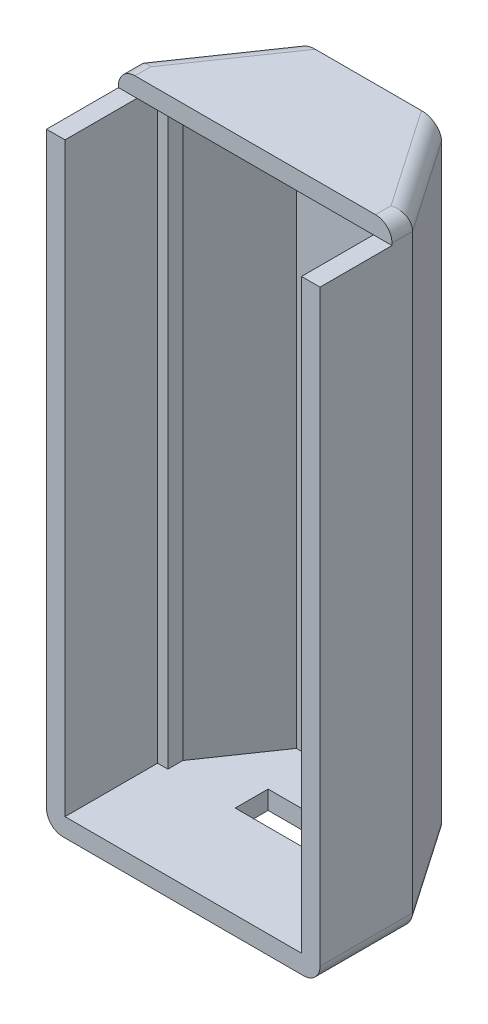
ISO-10303-21;
HEADER;
FILE_DESCRIPTION(('STEP AP214'),'2;1');
FILE_NAME('part.step','',(''),(''),'','','');
FILE_SCHEMA(('AUTOMOTIVE_DESIGN { 1 0 10303 214 1 1 1 1 }'));
ENDSEC;
DATA;
#1=APPLICATION_CONTEXT('core data for automotive mechanical design processes');
#2=APPLICATION_PROTOCOL_DEFINITION('international standard','automotive_design',2000,#1);
#3=PRODUCT_CONTEXT('',#1,'mechanical');
#4=PRODUCT('Part','Part','',(#3));
#5=PRODUCT_RELATED_PRODUCT_CATEGORY('part','',(#4));
#6=PRODUCT_DEFINITION_FORMATION('','',#4);
#7=PRODUCT_DEFINITION_CONTEXT('part definition',#1,'design');
#8=PRODUCT_DEFINITION('design','',#6,#7);
#9=PRODUCT_DEFINITION_SHAPE('','',#8);
#10=(LENGTH_UNIT() NAMED_UNIT(*) SI_UNIT(.MILLI.,.METRE.));
#11=(NAMED_UNIT(*) PLANE_ANGLE_UNIT() SI_UNIT($,.RADIAN.));
#12=(NAMED_UNIT(*) SI_UNIT($,.STERADIAN.) SOLID_ANGLE_UNIT());
#13=UNCERTAINTY_MEASURE_WITH_UNIT(LENGTH_MEASURE(1.E-05),#10,'distance_accuracy_value','');
#14=(GEOMETRIC_REPRESENTATION_CONTEXT(3) GLOBAL_UNCERTAINTY_ASSIGNED_CONTEXT((#13)) GLOBAL_UNIT_ASSIGNED_CONTEXT((#10,
#11,#12)) REPRESENTATION_CONTEXT('',''));
#15=CARTESIAN_POINT('',(0.,0.,0.));
#16=DIRECTION('',(0.,0.,1.));
#17=DIRECTION('',(1.,0.,0.));
#18=AXIS2_PLACEMENT_3D('',#15,#16,#17);
#19=CARTESIAN_POINT('',(0.,57.,0.));
#20=DIRECTION('',(0.,-1.,0.));
#21=DIRECTION('',(0.,0.,-1.));
#22=AXIS2_PLACEMENT_3D('',#19,#20,#21);
#23=PLANE('',#22);
#24=DIRECTION('',(1.,0.,0.));
#25=VECTOR('',#24,1.);
#26=CARTESIAN_POINT('',(13.3,57.,-7.));
#27=LINE('',#26,#25);
#28=CARTESIAN_POINT('',(-13.3,57.,-7.));
#29=VERTEX_POINT('',#28);
#30=CARTESIAN_POINT('',(-11.5,57.,-7.));
#31=VERTEX_POINT('',#30);
#32=EDGE_CURVE('E285',#29,#31,#27,.T.);
#33=ORIENTED_EDGE('',*,*,#32,.F.);
#34=DIRECTION('',(0.,0.,1.));
#35=VECTOR('',#34,1.);
#36=CARTESIAN_POINT('',(-13.3,57.,0.));
#37=LINE('',#36,#35);
#38=CARTESIAN_POINT('',(-13.3,57.,0.));
#39=VERTEX_POINT('',#38);
#40=EDGE_CURVE('E275',#29,#39,#37,.T.);
#41=ORIENTED_EDGE('',*,*,#40,.T.);
#42=DIRECTION('',(1.,0.,0.));
#43=VECTOR('',#42,1.);
#44=CARTESIAN_POINT('',(-11.5,57.,0.));
#45=LINE('',#44,#43);
#46=CARTESIAN_POINT('',(-11.5,57.,0.));
#47=VERTEX_POINT('',#46);
#48=EDGE_CURVE('E405',#39,#47,#45,.T.);
#49=ORIENTED_EDGE('',*,*,#48,.T.);
#50=DIRECTION('',(0.,0.,-1.));
#51=VECTOR('',#50,1.);
#52=CARTESIAN_POINT('',(-11.5,57.,0.));
#53=LINE('',#52,#51);
#54=EDGE_CURVE('E458',#47,#31,#53,.T.);
#55=ORIENTED_EDGE('',*,*,#54,.T.);
#56=EDGE_LOOP('',(#33,#41,#49,#55));
#57=FACE_BOUND('',#56,.T.);
#58=ADVANCED_FACE('F35',(#57),#23,.F.);
#59=CARTESIAN_POINT('',(11.5,57.,-7.));
#60=VERTEX_POINT('',#59);
#61=CARTESIAN_POINT('',(13.3,57.,-7.));
#62=VERTEX_POINT('',#61);
#63=EDGE_CURVE('E270',#60,#62,#27,.T.);
#64=ORIENTED_EDGE('',*,*,#63,.F.);
#65=DIRECTION('',(0.,0.,1.));
#66=VECTOR('',#65,1.);
#67=CARTESIAN_POINT('',(11.5,57.,0.));
#68=LINE('',#67,#66);
#69=CARTESIAN_POINT('',(11.5,57.,0.));
#70=VERTEX_POINT('',#69);
#71=EDGE_CURVE('E436',#60,#70,#68,.T.);
#72=ORIENTED_EDGE('',*,*,#71,.T.);
#73=DIRECTION('',(1.,0.,0.));
#74=VECTOR('',#73,1.);
#75=CARTESIAN_POINT('',(13.3,57.,0.));
#76=LINE('',#75,#74);
#77=CARTESIAN_POINT('',(13.3,57.,0.));
#78=VERTEX_POINT('',#77);
#79=EDGE_CURVE('E273',#70,#78,#76,.T.);
#80=ORIENTED_EDGE('',*,*,#79,.T.);
#81=DIRECTION('',(0.,0.,-1.));
#82=VECTOR('',#81,1.);
#83=CARTESIAN_POINT('',(13.3,57.,-9.));
#84=LINE('',#83,#82);
#85=EDGE_CURVE('E259',#78,#62,#84,.T.);
#86=ORIENTED_EDGE('',*,*,#85,.T.);
#87=EDGE_LOOP('',(#64,#72,#80,#86));
#88=FACE_BOUND('',#87,.T.);
#89=ADVANCED_FACE('F269',(#88),#23,.F.);
#90=CARTESIAN_POINT('',(-11.5,57.,0.));
#91=DIRECTION('',(-1.,0.,0.));
#92=DIRECTION('',(0.,0.,1.));
#93=AXIS2_PLACEMENT_3D('',#90,#91,#92);
#94=PLANE('',#93);
#95=DIRECTION('',(0.,0.,-1.));
#96=VECTOR('',#95,1.);
#97=CARTESIAN_POINT('',(-11.5,0.,0.));
#98=LINE('',#97,#96);
#99=CARTESIAN_POINT('',(-11.5,0.,0.));
#100=VERTEX_POINT('',#99);
#101=CARTESIAN_POINT('',(-11.5,0.,-9.));
#102=VERTEX_POINT('',#101);
#103=EDGE_CURVE('E427',#100,#102,#98,.T.);
#104=ORIENTED_EDGE('',*,*,#103,.T.);
#105=DIRECTION('',(0.,-1.,0.));
#106=VECTOR('',#105,1.);
#107=CARTESIAN_POINT('',(-11.5,57.,-9.));
#108=LINE('',#107,#106);
#109=CARTESIAN_POINT('',(-11.5,57.,-9.));
#110=VERTEX_POINT('',#109);
#111=EDGE_CURVE('E358',#110,#102,#108,.T.);
#112=ORIENTED_EDGE('',*,*,#111,.F.);
#113=EDGE_CURVE('E461',#31,#110,#53,.T.);
#114=ORIENTED_EDGE('',*,*,#113,.F.);
#115=ORIENTED_EDGE('',*,*,#54,.F.);
#116=DIRECTION('',(0.,-1.,0.));
#117=VECTOR('',#116,1.);
#118=CARTESIAN_POINT('',(-11.5,57.,0.));
#119=LINE('',#118,#117);
#120=EDGE_CURVE('E355',#47,#100,#119,.T.);
#121=ORIENTED_EDGE('',*,*,#120,.T.);
#122=EDGE_LOOP('',(#104,#112,#114,#115,#121));
#123=FACE_BOUND('',#122,.T.);
#124=ADVANCED_FACE('F540',(#123),#94,.F.);
#125=CARTESIAN_POINT('',(-11.5,57.,-9.));
#126=DIRECTION('',(0.,0.,-1.));
#127=DIRECTION('',(-1.,0.,0.));
#128=AXIS2_PLACEMENT_3D('',#125,#126,#127);
#129=PLANE('',#128);
#130=DIRECTION('',(1.,0.,0.));
#131=VECTOR('',#130,1.);
#132=CARTESIAN_POINT('',(-11.5,0.,-9.));
#133=LINE('',#132,#131);
#134=CARTESIAN_POINT('',(-10.5,0.,-9.));
#135=VERTEX_POINT('',#134);
#136=EDGE_CURVE('E424',#102,#135,#133,.T.);
#137=ORIENTED_EDGE('',*,*,#136,.T.);
#138=DIRECTION('',(0.,-1.,0.));
#139=VECTOR('',#138,1.);
#140=CARTESIAN_POINT('',(-10.5,57.,-9.));
#141=LINE('',#140,#139);
#142=CARTESIAN_POINT('',(-10.5,57.,-9.));
#143=VERTEX_POINT('',#142);
#144=EDGE_CURVE('E361',#143,#135,#141,.T.);
#145=ORIENTED_EDGE('',*,*,#144,.F.);
#146=DIRECTION('',(1.,0.,0.));
#147=VECTOR('',#146,1.);
#148=CARTESIAN_POINT('',(-11.5,57.,-9.));
#149=LINE('',#148,#147);
#150=EDGE_CURVE('E455',#110,#143,#149,.T.);
#151=ORIENTED_EDGE('',*,*,#150,.F.);
#152=ORIENTED_EDGE('',*,*,#111,.T.);
#153=EDGE_LOOP('',(#137,#145,#151,#152));
#154=FACE_BOUND('',#153,.T.);
#155=ADVANCED_FACE('F648',(#154),#129,.F.);
#156=CARTESIAN_POINT('',(-10.5,57.,-9.));
#157=DIRECTION('',(-1.,0.,0.));
#158=DIRECTION('',(0.,0.,1.));
#159=AXIS2_PLACEMENT_3D('',#156,#157,#158);
#160=PLANE('',#159);
#161=DIRECTION('',(0.,0.,-1.));
#162=VECTOR('',#161,1.);
#163=CARTESIAN_POINT('',(-10.5,0.,-9.));
#164=LINE('',#163,#162);
#165=CARTESIAN_POINT('',(-10.5,0.,-10.4545454545455));
#166=VERTEX_POINT('',#165);
#167=EDGE_CURVE('E421',#135,#166,#164,.T.);
#168=ORIENTED_EDGE('',*,*,#167,.T.);
#169=DIRECTION('',(0.,-1.,0.));
#170=VECTOR('',#169,1.);
#171=CARTESIAN_POINT('',(-10.5,57.,-10.4545454545455));
#172=LINE('',#171,#170);
#173=CARTESIAN_POINT('',(-10.5,57.,-10.4545454545455));
#174=VERTEX_POINT('',#173);
#175=EDGE_CURVE('E364',#174,#166,#172,.T.);
#176=ORIENTED_EDGE('',*,*,#175,.F.);
#177=DIRECTION('',(0.,0.,-1.));
#178=VECTOR('',#177,1.);
#179=CARTESIAN_POINT('',(-10.5,57.,-9.));
#180=LINE('',#179,#178);
#181=EDGE_CURVE('E452',#143,#174,#180,.T.);
#182=ORIENTED_EDGE('',*,*,#181,.F.);
#183=ORIENTED_EDGE('',*,*,#144,.T.);
#184=EDGE_LOOP('',(#168,#176,#182,#183));
#185=FACE_BOUND('',#184,.T.);
#186=ADVANCED_FACE('F644',(#185),#160,.F.);
#187=CARTESIAN_POINT('',(-10.5,57.,-10.4545454545455));
#188=DIRECTION('',(-0.824041924199368,0.,-0.566528822887065));
#189=DIRECTION('',(-0.566528822887065,0.,0.824041924199368));
#190=AXIS2_PLACEMENT_3D('',#187,#188,#189);
#191=PLANE('',#190);
#192=DIRECTION('',(0.566528822887065,0.,-0.824041924199368));
#193=VECTOR('',#192,1.);
#194=CARTESIAN_POINT('',(-10.5,0.,-10.4545454545455));
#195=LINE('',#194,#193);
#196=CARTESIAN_POINT('',(-6.,0.,-17.));
#197=VERTEX_POINT('',#196);
#198=EDGE_CURVE('E418',#166,#197,#195,.T.);
#199=ORIENTED_EDGE('',*,*,#198,.T.);
#200=DIRECTION('',(0.,-1.,0.));
#201=VECTOR('',#200,1.);
#202=CARTESIAN_POINT('',(-6.,57.,-17.));
#203=LINE('',#202,#201);
#204=CARTESIAN_POINT('',(-6.,57.,-17.));
#205=VERTEX_POINT('',#204);
#206=EDGE_CURVE('E367',#205,#197,#203,.T.);
#207=ORIENTED_EDGE('',*,*,#206,.F.);
#208=DIRECTION('',(0.566528822887065,0.,-0.824041924199368));
#209=VECTOR('',#208,1.);
#210=CARTESIAN_POINT('',(-10.5,57.,-10.4545454545455));
#211=LINE('',#210,#209);
#212=EDGE_CURVE('E449',#174,#205,#211,.T.);
#213=ORIENTED_EDGE('',*,*,#212,.F.);
#214=ORIENTED_EDGE('',*,*,#175,.T.);
#215=EDGE_LOOP('',(#199,#207,#213,#214));
#216=FACE_BOUND('',#215,.T.);
#217=ADVANCED_FACE('F640',(#216),#191,.F.);
#218=CARTESIAN_POINT('',(-6.,57.,-17.));
#219=DIRECTION('',(0.,0.,-1.));
#220=DIRECTION('',(-1.,0.,0.));
#221=AXIS2_PLACEMENT_3D('',#218,#219,#220);
#222=PLANE('',#221);
#223=DIRECTION('',(1.,0.,0.));
#224=VECTOR('',#223,1.);
#225=CARTESIAN_POINT('',(-6.,16.7,-17.));
#226=LINE('',#225,#224);
#227=CARTESIAN_POINT('',(-0.799999999999997,16.7,-17.));
#228=VERTEX_POINT('',#227);
#229=CARTESIAN_POINT('',(5.7,16.7,-17.));
#230=VERTEX_POINT('',#229);
#231=EDGE_CURVE('E466',#228,#230,#226,.T.);
#232=ORIENTED_EDGE('',*,*,#231,.T.);
#233=DIRECTION('',(0.,-1.,0.));
#234=VECTOR('',#233,1.);
#235=CARTESIAN_POINT('',(5.70000000000001,57.,-17.));
#236=LINE('',#235,#234);
#237=CARTESIAN_POINT('',(5.7,8.2,-17.));
#238=VERTEX_POINT('',#237);
#239=EDGE_CURVE('E430',#230,#238,#236,.T.);
#240=ORIENTED_EDGE('',*,*,#239,.T.);
#241=DIRECTION('',(-1.,0.,0.));
#242=VECTOR('',#241,1.);
#243=CARTESIAN_POINT('',(-6.,8.2,-17.));
#244=LINE('',#243,#242);
#245=CARTESIAN_POINT('',(-0.799999999999999,8.2,-17.));
#246=VERTEX_POINT('',#245);
#247=EDGE_CURVE('E472',#238,#246,#244,.T.);
#248=ORIENTED_EDGE('',*,*,#247,.T.);
#249=DIRECTION('',(0.,1.,0.));
#250=VECTOR('',#249,1.);
#251=CARTESIAN_POINT('',(-0.799999999999992,57.,-17.));
#252=LINE('',#251,#250);
#253=EDGE_CURVE('E469',#246,#228,#252,.T.);
#254=ORIENTED_EDGE('',*,*,#253,.T.);
#255=EDGE_LOOP('',(#232,#240,#248,#254));
#256=FACE_BOUND('',#255,.T.);
#257=DIRECTION('',(1.,0.,0.));
#258=VECTOR('',#257,1.);
#259=CARTESIAN_POINT('',(-6.,0.,-17.));
#260=LINE('',#259,#258);
#261=CARTESIAN_POINT('',(6.,0.,-17.));
#262=VERTEX_POINT('',#261);
#263=EDGE_CURVE('E415',#197,#262,#260,.T.);
#264=ORIENTED_EDGE('',*,*,#263,.T.);
#265=DIRECTION('',(0.,-1.,0.));
#266=VECTOR('',#265,1.);
#267=CARTESIAN_POINT('',(6.,57.,-17.));
#268=LINE('',#267,#266);
#269=CARTESIAN_POINT('',(6.,57.,-17.));
#270=VERTEX_POINT('',#269);
#271=EDGE_CURVE('E370',#270,#262,#268,.T.);
#272=ORIENTED_EDGE('',*,*,#271,.F.);
#273=DIRECTION('',(1.,0.,0.));
#274=VECTOR('',#273,1.);
#275=CARTESIAN_POINT('',(-6.,57.,-17.));
#276=LINE('',#275,#274);
#277=EDGE_CURVE('E446',#205,#270,#276,.T.);
#278=ORIENTED_EDGE('',*,*,#277,.F.);
#279=ORIENTED_EDGE('',*,*,#206,.T.);
#280=EDGE_LOOP('',(#264,#272,#278,#279));
#281=FACE_BOUND('',#280,.T.);
#282=ADVANCED_FACE('F636',(#256,#281),#222,.F.);
#283=CARTESIAN_POINT('',(10.5,57.,-10.4545454545455));
#284=DIRECTION('',(0.824041924199368,0.,-0.566528822887065));
#285=DIRECTION('',(-0.566528822887065,0.,-0.824041924199368));
#286=AXIS2_PLACEMENT_3D('',#283,#284,#285);
#287=PLANE('',#286);
#288=DIRECTION('',(0.566528822887065,0.,0.824041924199368));
#289=VECTOR('',#288,1.);
#290=CARTESIAN_POINT('',(10.5,0.,-10.4545454545455));
#291=LINE('',#290,#289);
#292=CARTESIAN_POINT('',(10.5,0.,-10.4545454545455));
#293=VERTEX_POINT('',#292);
#294=EDGE_CURVE('E412',#262,#293,#291,.T.);
#295=ORIENTED_EDGE('',*,*,#294,.T.);
#296=DIRECTION('',(0.,-1.,0.));
#297=VECTOR('',#296,1.);
#298=CARTESIAN_POINT('',(10.5,57.,-10.4545454545455));
#299=LINE('',#298,#297);
#300=CARTESIAN_POINT('',(10.5,57.,-10.4545454545455));
#301=VERTEX_POINT('',#300);
#302=EDGE_CURVE('E373',#301,#293,#299,.T.);
#303=ORIENTED_EDGE('',*,*,#302,.F.);
#304=DIRECTION('',(0.566528822887065,0.,0.824041924199368));
#305=VECTOR('',#304,1.);
#306=CARTESIAN_POINT('',(10.5,57.,-10.4545454545455));
#307=LINE('',#306,#305);
#308=EDGE_CURVE('E443',#270,#301,#307,.T.);
#309=ORIENTED_EDGE('',*,*,#308,.F.);
#310=ORIENTED_EDGE('',*,*,#271,.T.);
#311=EDGE_LOOP('',(#295,#303,#309,#310));
#312=FACE_BOUND('',#311,.T.);
#313=ADVANCED_FACE('F632',(#312),#287,.F.);
#314=CARTESIAN_POINT('',(10.5,57.,-9.));
#315=DIRECTION('',(1.,0.,0.));
#316=DIRECTION('',(0.,0.,-1.));
#317=AXIS2_PLACEMENT_3D('',#314,#315,#316);
#318=PLANE('',#317);
#319=DIRECTION('',(0.,0.,1.));
#320=VECTOR('',#319,1.);
#321=CARTESIAN_POINT('',(10.5,0.,-9.));
#322=LINE('',#321,#320);
#323=CARTESIAN_POINT('',(10.5,0.,-9.));
#324=VERTEX_POINT('',#323);
#325=EDGE_CURVE('E409',#293,#324,#322,.T.);
#326=ORIENTED_EDGE('',*,*,#325,.T.);
#327=DIRECTION('',(0.,-1.,0.));
#328=VECTOR('',#327,1.);
#329=CARTESIAN_POINT('',(10.5,57.,-9.));
#330=LINE('',#329,#328);
#331=CARTESIAN_POINT('',(10.5,57.,-9.));
#332=VERTEX_POINT('',#331);
#333=EDGE_CURVE('E376',#332,#324,#330,.T.);
#334=ORIENTED_EDGE('',*,*,#333,.F.);
#335=DIRECTION('',(0.,0.,1.));
#336=VECTOR('',#335,1.);
#337=CARTESIAN_POINT('',(10.5,57.,-9.));
#338=LINE('',#337,#336);
#339=EDGE_CURVE('E440',#301,#332,#338,.T.);
#340=ORIENTED_EDGE('',*,*,#339,.F.);
#341=ORIENTED_EDGE('',*,*,#302,.T.);
#342=EDGE_LOOP('',(#326,#334,#340,#341));
#343=FACE_BOUND('',#342,.T.);
#344=ADVANCED_FACE('F628',(#343),#318,.F.);
#345=CARTESIAN_POINT('',(11.5,57.,-9.));
#346=DIRECTION('',(0.,0.,-1.));
#347=DIRECTION('',(-1.,0.,0.));
#348=AXIS2_PLACEMENT_3D('',#345,#346,#347);
#349=PLANE('',#348);
#350=DIRECTION('',(1.,0.,0.));
#351=VECTOR('',#350,1.);
#352=CARTESIAN_POINT('',(11.5,0.,-9.));
#353=LINE('',#352,#351);
#354=CARTESIAN_POINT('',(11.5,0.,-9.));
#355=VERTEX_POINT('',#354);
#356=EDGE_CURVE('E406',#324,#355,#353,.T.);
#357=ORIENTED_EDGE('',*,*,#356,.T.);
#358=DIRECTION('',(0.,-1.,0.));
#359=VECTOR('',#358,1.);
#360=CARTESIAN_POINT('',(11.5,57.,-9.));
#361=LINE('',#360,#359);
#362=CARTESIAN_POINT('',(11.5,57.,-9.));
#363=VERTEX_POINT('',#362);
#364=EDGE_CURVE('E379',#363,#355,#361,.T.);
#365=ORIENTED_EDGE('',*,*,#364,.F.);
#366=DIRECTION('',(1.,0.,0.));
#367=VECTOR('',#366,1.);
#368=CARTESIAN_POINT('',(11.5,57.,-9.));
#369=LINE('',#368,#367);
#370=EDGE_CURVE('E437',#332,#363,#369,.T.);
#371=ORIENTED_EDGE('',*,*,#370,.F.);
#372=ORIENTED_EDGE('',*,*,#333,.T.);
#373=EDGE_LOOP('',(#357,#365,#371,#372));
#374=FACE_BOUND('',#373,.T.);
#375=ADVANCED_FACE('F625',(#374),#349,.F.);
#376=CARTESIAN_POINT('',(11.5,57.,0.));
#377=DIRECTION('',(1.,0.,0.));
#378=DIRECTION('',(0.,0.,-1.));
#379=AXIS2_PLACEMENT_3D('',#376,#377,#378);
#380=PLANE('',#379);
#381=DIRECTION('',(0.,0.,1.));
#382=VECTOR('',#381,1.);
#383=CARTESIAN_POINT('',(11.5,0.,0.));
#384=LINE('',#383,#382);
#385=CARTESIAN_POINT('',(11.5,0.,0.));
#386=VERTEX_POINT('',#385);
#387=EDGE_CURVE('E402',#355,#386,#384,.T.);
#388=ORIENTED_EDGE('',*,*,#387,.T.);
#389=DIRECTION('',(0.,-1.,0.));
#390=VECTOR('',#389,1.);
#391=CARTESIAN_POINT('',(11.5,57.,0.));
#392=LINE('',#391,#390);
#393=EDGE_CURVE('E382',#70,#386,#392,.T.);
#394=ORIENTED_EDGE('',*,*,#393,.F.);
#395=ORIENTED_EDGE('',*,*,#71,.F.);
#396=EDGE_CURVE('E433',#363,#60,#68,.T.);
#397=ORIENTED_EDGE('',*,*,#396,.F.);
#398=ORIENTED_EDGE('',*,*,#364,.T.);
#399=EDGE_LOOP('',(#388,#394,#395,#397,#398));
#400=FACE_BOUND('',#399,.T.);
#401=ADVANCED_FACE('F548',(#400),#380,.F.);
#402=CARTESIAN_POINT('',(13.3,57.,0.));
#403=DIRECTION('',(0.,0.,-1.));
#404=DIRECTION('',(-1.,0.,0.));
#405=AXIS2_PLACEMENT_3D('',#402,#403,#404);
#406=PLANE('',#405);
#407=DIRECTION('',(0.,-1.,0.));
#408=VECTOR('',#407,1.);
#409=CARTESIAN_POINT('',(-13.3,57.,0.));
#410=LINE('',#409,#408);
#411=CARTESIAN_POINT('',(-13.3,-0.199999999999985,0.));
#412=VERTEX_POINT('',#411);
#413=EDGE_CURVE('E399',#39,#412,#410,.T.);
#414=ORIENTED_EDGE('',*,*,#413,.T.);
#415=CARTESIAN_POINT('',(-11.7,-0.2,0.));
#416=DIRECTION('',(0.,0.,-1.));
#417=DIRECTION('',(-1.,0.,0.));
#418=AXIS2_PLACEMENT_3D('',#415,#416,#417);
#419=CIRCLE('',#418,1.6);
#420=CARTESIAN_POINT('',(-11.7,-1.8,0.));
#421=VERTEX_POINT('',#420);
#422=EDGE_CURVE('E11',#412,#421,#419,.F.);
#423=ORIENTED_EDGE('',*,*,#422,.T.);
#424=DIRECTION('',(-1.,0.,0.));
#425=VECTOR('',#424,1.);
#426=CARTESIAN_POINT('',(13.3,-1.8,0.));
#427=LINE('',#426,#425);
#428=CARTESIAN_POINT('',(11.7,-1.8,0.));
#429=VERTEX_POINT('',#428);
#430=EDGE_CURVE('E499',#429,#421,#427,.T.);
#431=ORIENTED_EDGE('',*,*,#430,.F.);
#432=CARTESIAN_POINT('',(11.7,-0.2,0.));
#433=DIRECTION('',(0.,0.,-1.));
#434=DIRECTION('',(-1.,0.,0.));
#435=AXIS2_PLACEMENT_3D('',#432,#433,#434);
#436=CIRCLE('',#435,1.6);
#437=CARTESIAN_POINT('',(13.3,-0.199999999999985,0.));
#438=VERTEX_POINT('',#437);
#439=EDGE_CURVE('E44',#429,#438,#436,.F.);
#440=ORIENTED_EDGE('',*,*,#439,.T.);
#441=DIRECTION('',(0.,-1.,0.));
#442=VECTOR('',#441,1.);
#443=CARTESIAN_POINT('',(13.3,57.,0.));
#444=LINE('',#443,#442);
#445=EDGE_CURVE('E385',#78,#438,#444,.T.);
#446=ORIENTED_EDGE('',*,*,#445,.F.);
#447=ORIENTED_EDGE('',*,*,#79,.F.);
#448=ORIENTED_EDGE('',*,*,#393,.T.);
#449=DIRECTION('',(-1.,0.,0.));
#450=VECTOR('',#449,1.);
#451=CARTESIAN_POINT('',(13.3,0.,0.));
#452=LINE('',#451,#450);
#453=EDGE_CURVE('E496',#386,#100,#452,.T.);
#454=ORIENTED_EDGE('',*,*,#453,.T.);
#455=ORIENTED_EDGE('',*,*,#120,.F.);
#456=ORIENTED_EDGE('',*,*,#48,.F.);
#457=EDGE_LOOP('',(#414,#423,#431,#440,#446,#447,#448,#454,#455,#456));
#458=FACE_BOUND('',#457,.T.);
#459=ADVANCED_FACE('F538',(#458),#406,.F.);
#460=CARTESIAN_POINT('',(13.3,57.,-9.));
#461=DIRECTION('',(-1.,0.,0.));
#462=DIRECTION('',(0.,0.,1.));
#463=AXIS2_PLACEMENT_3D('',#460,#461,#462);
#464=PLANE('',#463);
#465=DIRECTION('',(0.,-1.,0.));
#466=VECTOR('',#465,1.);
#467=CARTESIAN_POINT('',(13.3,57.,-9.));
#468=LINE('',#467,#466);
#469=CARTESIAN_POINT('',(13.3,57.2,-9.));
#470=VERTEX_POINT('',#469);
#471=CARTESIAN_POINT('',(13.3,-0.199999999999985,-9.));
#472=VERTEX_POINT('',#471);
#473=EDGE_CURVE('E387',#470,#472,#468,.T.);
#474=ORIENTED_EDGE('',*,*,#473,.F.);
#475=DIRECTION('',(0.,0.,-1.));
#476=VECTOR('',#475,1.);
#477=CARTESIAN_POINT('',(13.3,57.2,-9.));
#478=LINE('',#477,#476);
#479=CARTESIAN_POINT('',(13.3,57.2,-7.));
#480=VERTEX_POINT('',#479);
#481=EDGE_CURVE('E261',#470,#480,#478,.F.);
#482=ORIENTED_EDGE('',*,*,#481,.T.);
#483=DIRECTION('',(0.,-1.,0.));
#484=VECTOR('',#483,1.);
#485=CARTESIAN_POINT('',(13.3,58.8,-7.));
#486=LINE('',#485,#484);
#487=EDGE_CURVE('E254',#480,#62,#486,.T.);
#488=ORIENTED_EDGE('',*,*,#487,.T.);
#489=ORIENTED_EDGE('',*,*,#85,.F.);
#490=ORIENTED_EDGE('',*,*,#445,.T.);
#491=DIRECTION('',(0.,0.,1.));
#492=VECTOR('',#491,1.);
#493=CARTESIAN_POINT('',(13.3,-0.2,-9.));
#494=LINE('',#493,#492);
#495=EDGE_CURVE('E338',#438,#472,#494,.F.);
#496=ORIENTED_EDGE('',*,*,#495,.T.);
#497=EDGE_LOOP('',(#474,#482,#488,#489,#490,#496));
#498=FACE_BOUND('',#497,.T.);
#499=ADVANCED_FACE('F257',(#498),#464,.F.);
#500=CARTESIAN_POINT('',(7.1125,57.,-18.));
#501=DIRECTION('',(-0.824041924199367,0.,0.566528822887066));
#502=DIRECTION('',(0.566528822887066,0.,0.824041924199367));
#503=AXIS2_PLACEMENT_3D('',#500,#501,#502);
#504=PLANE('',#503);
#505=DIRECTION('',(0.,-1.,0.));
#506=VECTOR('',#505,1.);
#507=CARTESIAN_POINT('',(7.1125,57.,-18.));
#508=LINE('',#507,#506);
#509=CARTESIAN_POINT('',(7.1125,57.2,-18.));
#510=VERTEX_POINT('',#509);
#511=CARTESIAN_POINT('',(7.1125,-0.199999999999985,-18.));
#512=VERTEX_POINT('',#511);
#513=EDGE_CURVE('E390',#510,#512,#508,.T.);
#514=ORIENTED_EDGE('',*,*,#513,.F.);
#515=DIRECTION('',(-0.566528822887066,0.,-0.824041924199367));
#516=VECTOR('',#515,1.);
#517=CARTESIAN_POINT('',(7.1125,57.2,-18.));
#518=LINE('',#517,#516);
#519=EDGE_CURVE('E321',#510,#470,#518,.F.);
#520=ORIENTED_EDGE('',*,*,#519,.T.);
#521=ORIENTED_EDGE('',*,*,#473,.T.);
#522=DIRECTION('',(0.566528822887066,0.,0.824041924199367));
#523=VECTOR('',#522,1.);
#524=CARTESIAN_POINT('',(7.1125,-0.2,-18.));
#525=LINE('',#524,#523);
#526=EDGE_CURVE('E323',#472,#512,#525,.F.);
#527=ORIENTED_EDGE('',*,*,#526,.T.);
#528=EDGE_LOOP('',(#514,#520,#521,#527));
#529=FACE_BOUND('',#528,.T.);
#530=ADVANCED_FACE('F567',(#529),#504,.F.);
#531=CARTESIAN_POINT('',(-7.1125,57.,-18.));
#532=DIRECTION('',(0.,0.,1.));
#533=DIRECTION('',(1.,0.,0.));
#534=AXIS2_PLACEMENT_3D('',#531,#532,#533);
#535=PLANE('',#534);
#536=DIRECTION('',(-1.,0.,0.));
#537=VECTOR('',#536,1.);
#538=CARTESIAN_POINT('',(5.7,8.2,-18.));
#539=LINE('',#538,#537);
#540=CARTESIAN_POINT('',(5.7,8.2,-18.));
#541=VERTEX_POINT('',#540);
#542=CARTESIAN_POINT('',(-0.799999999999998,8.2,-18.));
#543=VERTEX_POINT('',#542);
#544=EDGE_CURVE('E490',#541,#543,#539,.T.);
#545=ORIENTED_EDGE('',*,*,#544,.F.);
#546=DIRECTION('',(0.,-1.,0.));
#547=VECTOR('',#546,1.);
#548=CARTESIAN_POINT('',(5.7,16.7,-18.));
#549=LINE('',#548,#547);
#550=CARTESIAN_POINT('',(5.7,16.7,-18.));
#551=VERTEX_POINT('',#550);
#552=EDGE_CURVE('E493',#551,#541,#549,.T.);
#553=ORIENTED_EDGE('',*,*,#552,.F.);
#554=DIRECTION('',(1.,0.,0.));
#555=VECTOR('',#554,1.);
#556=CARTESIAN_POINT('',(5.7,16.7,-18.));
#557=LINE('',#556,#555);
#558=CARTESIAN_POINT('',(-0.799999999999997,16.7,-18.));
#559=VERTEX_POINT('',#558);
#560=EDGE_CURVE('E480',#559,#551,#557,.T.);
#561=ORIENTED_EDGE('',*,*,#560,.F.);
#562=DIRECTION('',(0.,1.,0.));
#563=VECTOR('',#562,1.);
#564=CARTESIAN_POINT('',(-0.799999999999997,16.7,-18.));
#565=LINE('',#564,#563);
#566=EDGE_CURVE('E487',#543,#559,#565,.T.);
#567=ORIENTED_EDGE('',*,*,#566,.F.);
#568=EDGE_LOOP('',(#545,#553,#561,#567));
#569=FACE_BOUND('',#568,.T.);
#570=DIRECTION('',(-1.,0.,0.));
#571=VECTOR('',#570,1.);
#572=CARTESIAN_POINT('',(-7.1125,58.8,-18.));
#573=LINE('',#572,#571);
#574=CARTESIAN_POINT('',(5.17085121610524,58.8,-18.));
#575=VERTEX_POINT('',#574);
#576=CARTESIAN_POINT('',(-5.17085121610524,58.8,-18.));
#577=VERTEX_POINT('',#576);
#578=EDGE_CURVE('E266',#575,#577,#573,.T.);
#579=ORIENTED_EDGE('',*,*,#578,.F.);
#580=CARTESIAN_POINT('',(5.17085121610524,57.2,-18.));
#581=DIRECTION('',(0.,0.,1.));
#582=DIRECTION('',(-1.,0.,0.));
#583=AXIS2_PLACEMENT_3D('',#580,#581,#582);
#584=ELLIPSE('',#583,1.94164878389476,1.6);
#585=EDGE_CURVE('E325',#575,#510,#584,.F.);
#586=ORIENTED_EDGE('',*,*,#585,.T.);
#587=ORIENTED_EDGE('',*,*,#513,.T.);
#588=CARTESIAN_POINT('',(5.17085121610524,-0.2,-18.));
#589=DIRECTION('',(0.,0.,1.));
#590=DIRECTION('',(-1.,0.,0.));
#591=AXIS2_PLACEMENT_3D('',#588,#589,#590);
#592=ELLIPSE('',#591,1.94164878389476,1.6);
#593=CARTESIAN_POINT('',(5.17085121610524,-1.8,-18.));
#594=VERTEX_POINT('',#593);
#595=EDGE_CURVE('E331',#512,#594,#592,.F.);
#596=ORIENTED_EDGE('',*,*,#595,.T.);
#597=DIRECTION('',(1.,0.,0.));
#598=VECTOR('',#597,1.);
#599=CARTESIAN_POINT('',(-7.1125,-1.8,-18.));
#600=LINE('',#599,#598);
#601=CARTESIAN_POINT('',(-5.17085121610524,-1.8,-18.));
#602=VERTEX_POINT('',#601);
#603=EDGE_CURVE('E495',#602,#594,#600,.T.);
#604=ORIENTED_EDGE('',*,*,#603,.F.);
#605=CARTESIAN_POINT('',(-5.17085121610524,-0.2,-18.));
#606=DIRECTION('',(0.,0.,1.));
#607=DIRECTION('',(-1.,0.,0.));
#608=AXIS2_PLACEMENT_3D('',#605,#606,#607);
#609=ELLIPSE('',#608,1.94164878389476,1.6);
#610=CARTESIAN_POINT('',(-7.1125,-0.199999999999985,-18.));
#611=VERTEX_POINT('',#610);
#612=EDGE_CURVE('E329',#602,#611,#609,.F.);
#613=ORIENTED_EDGE('',*,*,#612,.T.);
#614=DIRECTION('',(0.,-1.,0.));
#615=VECTOR('',#614,1.);
#616=CARTESIAN_POINT('',(-7.1125,57.,-18.));
#617=LINE('',#616,#615);
#618=CARTESIAN_POINT('',(-7.1125,57.2,-18.));
#619=VERTEX_POINT('',#618);
#620=EDGE_CURVE('E393',#619,#611,#617,.T.);
#621=ORIENTED_EDGE('',*,*,#620,.F.);
#622=CARTESIAN_POINT('',(-5.17085121610524,57.2,-18.));
#623=DIRECTION('',(0.,0.,1.));
#624=DIRECTION('',(-1.,0.,0.));
#625=AXIS2_PLACEMENT_3D('',#622,#623,#624);
#626=ELLIPSE('',#625,1.94164878389476,1.6);
#627=EDGE_CURVE('E327',#619,#577,#626,.F.);
#628=ORIENTED_EDGE('',*,*,#627,.T.);
#629=EDGE_LOOP('',(#579,#586,#587,#596,#604,#613,#621,#628));
#630=FACE_BOUND('',#629,.T.);
#631=ADVANCED_FACE('F561',(#569,#630),#535,.F.);
#632=CARTESIAN_POINT('',(-13.3,57.,-9.));
#633=DIRECTION('',(0.824041924199368,0.,0.566528822887065));
#634=DIRECTION('',(0.566528822887065,0.,-0.824041924199368));
#635=AXIS2_PLACEMENT_3D('',#632,#633,#634);
#636=PLANE('',#635);
#637=DIRECTION('',(0.,-1.,0.));
#638=VECTOR('',#637,1.);
#639=CARTESIAN_POINT('',(-13.3,57.,-9.));
#640=LINE('',#639,#638);
#641=CARTESIAN_POINT('',(-13.3,57.2,-9.));
#642=VERTEX_POINT('',#641);
#643=CARTESIAN_POINT('',(-13.3,-0.199999999999985,-9.));
#644=VERTEX_POINT('',#643);
#645=EDGE_CURVE('E396',#642,#644,#640,.T.);
#646=ORIENTED_EDGE('',*,*,#645,.F.);
#647=DIRECTION('',(-0.566528822887065,0.,0.824041924199368));
#648=VECTOR('',#647,1.);
#649=CARTESIAN_POINT('',(-13.3,57.2,-9.));
#650=LINE('',#649,#648);
#651=EDGE_CURVE('E317',#642,#619,#650,.F.);
#652=ORIENTED_EDGE('',*,*,#651,.T.);
#653=ORIENTED_EDGE('',*,*,#620,.T.);
#654=DIRECTION('',(0.566528822887065,0.,-0.824041924199368));
#655=VECTOR('',#654,1.);
#656=CARTESIAN_POINT('',(-13.3,-0.2,-9.));
#657=LINE('',#656,#655);
#658=EDGE_CURVE('E319',#611,#644,#657,.F.);
#659=ORIENTED_EDGE('',*,*,#658,.T.);
#660=EDGE_LOOP('',(#646,#652,#653,#659));
#661=FACE_BOUND('',#660,.T.);
#662=ADVANCED_FACE('F583',(#661),#636,.F.);
#663=CARTESIAN_POINT('',(-13.3,57.,0.));
#664=DIRECTION('',(1.,0.,0.));
#665=DIRECTION('',(0.,0.,-1.));
#666=AXIS2_PLACEMENT_3D('',#663,#664,#665);
#667=PLANE('',#666);
#668=DIRECTION('',(0.,-1.,0.));
#669=VECTOR('',#668,1.);
#670=CARTESIAN_POINT('',(-13.3,58.8,-7.));
#671=LINE('',#670,#669);
#672=CARTESIAN_POINT('',(-13.3,57.2,-7.));
#673=VERTEX_POINT('',#672);
#674=EDGE_CURVE('E265',#673,#29,#671,.T.);
#675=ORIENTED_EDGE('',*,*,#674,.F.);
#676=DIRECTION('',(0.,0.,1.));
#677=VECTOR('',#676,1.);
#678=CARTESIAN_POINT('',(-13.3,57.2,0.));
#679=LINE('',#678,#677);
#680=EDGE_CURVE('E313',#673,#642,#679,.F.);
#681=ORIENTED_EDGE('',*,*,#680,.T.);
#682=ORIENTED_EDGE('',*,*,#645,.T.);
#683=DIRECTION('',(0.,0.,-1.));
#684=VECTOR('',#683,1.);
#685=CARTESIAN_POINT('',(-13.3,-0.2,0.));
#686=LINE('',#685,#684);
#687=EDGE_CURVE('E315',#644,#412,#686,.F.);
#688=ORIENTED_EDGE('',*,*,#687,.T.);
#689=ORIENTED_EDGE('',*,*,#413,.F.);
#690=ORIENTED_EDGE('',*,*,#40,.F.);
#691=EDGE_LOOP('',(#675,#681,#682,#688,#689,#690));
#692=FACE_BOUND('',#691,.T.);
#693=ADVANCED_FACE('F533',(#692),#667,.F.);
#694=CARTESIAN_POINT('',(5.7,16.7,0.));
#695=DIRECTION('',(1.,0.,0.));
#696=DIRECTION('',(0.,1.,0.));
#697=AXIS2_PLACEMENT_3D('',#694,#695,#696);
#698=PLANE('',#697);
#699=DIRECTION('',(0.,0.,-1.));
#700=VECTOR('',#699,1.);
#701=CARTESIAN_POINT('',(5.7,16.7,0.));
#702=LINE('',#701,#700);
#703=EDGE_CURVE('E475',#230,#551,#702,.T.);
#704=ORIENTED_EDGE('',*,*,#703,.T.);
#705=ORIENTED_EDGE('',*,*,#552,.T.);
#706=DIRECTION('',(0.,0.,-1.));
#707=VECTOR('',#706,1.);
#708=CARTESIAN_POINT('',(5.7,8.2,0.));
#709=LINE('',#708,#707);
#710=EDGE_CURVE('E476',#238,#541,#709,.T.);
#711=ORIENTED_EDGE('',*,*,#710,.F.);
#712=ORIENTED_EDGE('',*,*,#239,.F.);
#713=EDGE_LOOP('',(#704,#705,#711,#712));
#714=FACE_BOUND('',#713,.T.);
#715=ADVANCED_FACE('F608',(#714),#698,.F.);
#716=CARTESIAN_POINT('',(5.7,16.7,0.));
#717=DIRECTION('',(0.,1.,0.));
#718=DIRECTION('',(0.,0.,1.));
#719=AXIS2_PLACEMENT_3D('',#716,#717,#718);
#720=PLANE('',#719);
#721=DIRECTION('',(0.,0.,-1.));
#722=VECTOR('',#721,1.);
#723=CARTESIAN_POINT('',(-0.799999999999997,16.7,0.));
#724=LINE('',#723,#722);
#725=EDGE_CURVE('E482',#228,#559,#724,.T.);
#726=ORIENTED_EDGE('',*,*,#725,.T.);
#727=ORIENTED_EDGE('',*,*,#560,.T.);
#728=ORIENTED_EDGE('',*,*,#703,.F.);
#729=ORIENTED_EDGE('',*,*,#231,.F.);
#730=EDGE_LOOP('',(#726,#727,#728,#729));
#731=FACE_BOUND('',#730,.T.);
#732=ADVANCED_FACE('F861',(#731),#720,.F.);
#733=CARTESIAN_POINT('',(-0.799999999999997,16.7,0.));
#734=DIRECTION('',(-1.,0.,0.));
#735=DIRECTION('',(0.,-1.,0.));
#736=AXIS2_PLACEMENT_3D('',#733,#734,#735);
#737=PLANE('',#736);
#738=DIRECTION('',(0.,0.,-1.));
#739=VECTOR('',#738,1.);
#740=CARTESIAN_POINT('',(-0.799999999999998,8.2,0.));
#741=LINE('',#740,#739);
#742=EDGE_CURVE('E479',#246,#543,#741,.T.);
#743=ORIENTED_EDGE('',*,*,#742,.T.);
#744=ORIENTED_EDGE('',*,*,#566,.T.);
#745=ORIENTED_EDGE('',*,*,#725,.F.);
#746=ORIENTED_EDGE('',*,*,#253,.F.);
#747=EDGE_LOOP('',(#743,#744,#745,#746));
#748=FACE_BOUND('',#747,.T.);
#749=ADVANCED_FACE('F854',(#748),#737,.F.);
#750=CARTESIAN_POINT('',(5.7,8.2,0.));
#751=DIRECTION('',(0.,-1.,0.));
#752=DIRECTION('',(0.,0.,-1.));
#753=AXIS2_PLACEMENT_3D('',#750,#751,#752);
#754=PLANE('',#753);
#755=ORIENTED_EDGE('',*,*,#710,.T.);
#756=ORIENTED_EDGE('',*,*,#544,.T.);
#757=ORIENTED_EDGE('',*,*,#742,.F.);
#758=ORIENTED_EDGE('',*,*,#247,.F.);
#759=EDGE_LOOP('',(#755,#756,#757,#758));
#760=FACE_BOUND('',#759,.T.);
#761=ADVANCED_FACE('F837',(#760),#754,.F.);
#762=CARTESIAN_POINT('',(0.,-1.8,0.));
#763=DIRECTION('',(0.,-1.,0.));
#764=DIRECTION('',(0.,0.,-1.));
#765=AXIS2_PLACEMENT_3D('',#762,#763,#764);
#766=PLANE('',#765);
#767=DIRECTION('',(0.,0.,-1.));
#768=VECTOR('',#767,1.);
#769=CARTESIAN_POINT('',(-3.95,-1.8,-9.));
#770=LINE('',#769,#768);
#771=CARTESIAN_POINT('',(-3.95,-1.8,-9.));
#772=VERTEX_POINT('',#771);
#773=CARTESIAN_POINT('',(-3.95,-1.8,-12.2));
#774=VERTEX_POINT('',#773);
#775=EDGE_CURVE('E522',#772,#774,#770,.T.);
#776=ORIENTED_EDGE('',*,*,#775,.F.);
#777=DIRECTION('',(-1.,0.,0.));
#778=VECTOR('',#777,1.);
#779=CARTESIAN_POINT('',(-3.95,-1.8,-9.));
#780=LINE('',#779,#778);
#781=CARTESIAN_POINT('',(3.95,-1.8,-9.));
#782=VERTEX_POINT('',#781);
#783=EDGE_CURVE('E509',#782,#772,#780,.T.);
#784=ORIENTED_EDGE('',*,*,#783,.F.);
#785=DIRECTION('',(0.,0.,1.));
#786=VECTOR('',#785,1.);
#787=CARTESIAN_POINT('',(3.95,-1.8,-9.));
#788=LINE('',#787,#786);
#789=CARTESIAN_POINT('',(3.95,-1.8,-12.2));
#790=VERTEX_POINT('',#789);
#791=EDGE_CURVE('E516',#790,#782,#788,.T.);
#792=ORIENTED_EDGE('',*,*,#791,.F.);
#793=DIRECTION('',(1.,0.,0.));
#794=VECTOR('',#793,1.);
#795=CARTESIAN_POINT('',(-3.95,-1.8,-12.2));
#796=LINE('',#795,#794);
#797=EDGE_CURVE('E519',#774,#790,#796,.T.);
#798=ORIENTED_EDGE('',*,*,#797,.F.);
#799=EDGE_LOOP('',(#776,#784,#792,#798));
#800=FACE_BOUND('',#799,.T.);
#801=ORIENTED_EDGE('',*,*,#430,.T.);
#802=DIRECTION('',(0.,0.,-1.));
#803=VECTOR('',#802,1.);
#804=CARTESIAN_POINT('',(-11.7,-1.8,-9.));
#805=LINE('',#804,#803);
#806=CARTESIAN_POINT('',(-11.7,-1.8,-8.50305631433489));
#807=VERTEX_POINT('',#806);
#808=EDGE_CURVE('E303',#421,#807,#805,.T.);
#809=ORIENTED_EDGE('',*,*,#808,.T.);
#810=DIRECTION('',(0.566528822887065,0.,-0.824041924199368));
#811=VECTOR('',#810,1.);
#812=CARTESIAN_POINT('',(-5.79403292128101,-1.8,-17.0935538833807));
#813=LINE('',#812,#811);
#814=EDGE_CURVE('E306',#807,#602,#813,.T.);
#815=ORIENTED_EDGE('',*,*,#814,.T.);
#816=ORIENTED_EDGE('',*,*,#603,.T.);
#817=DIRECTION('',(0.566528822887066,0.,0.824041924199367));
#818=VECTOR('',#817,1.);
#819=CARTESIAN_POINT('',(11.981532921281,-1.8,-8.0935538833807));
#820=LINE('',#819,#818);
#821=CARTESIAN_POINT('',(11.7,-1.8,-8.50305631433491));
#822=VERTEX_POINT('',#821);
#823=EDGE_CURVE('E308',#594,#822,#820,.T.);
#824=ORIENTED_EDGE('',*,*,#823,.T.);
#825=DIRECTION('',(0.,0.,1.));
#826=VECTOR('',#825,1.);
#827=CARTESIAN_POINT('',(11.7,-1.8,0.));
#828=LINE('',#827,#826);
#829=EDGE_CURVE('E311',#822,#429,#828,.T.);
#830=ORIENTED_EDGE('',*,*,#829,.T.);
#831=EDGE_LOOP('',(#801,#809,#815,#816,#824,#830));
#832=FACE_BOUND('',#831,.T.);
#833=ADVANCED_FACE('F555',(#800,#832),#766,.T.);
#834=CARTESIAN_POINT('',(0.,0.,0.));
#835=DIRECTION('',(0.,-1.,0.));
#836=DIRECTION('',(0.,0.,-1.));
#837=AXIS2_PLACEMENT_3D('',#834,#835,#836);
#838=PLANE('',#837);
#839=DIRECTION('',(-1.,0.,0.));
#840=VECTOR('',#839,1.);
#841=CARTESIAN_POINT('',(0.,0.,-9.));
#842=LINE('',#841,#840);
#843=CARTESIAN_POINT('',(3.95,0.,-9.));
#844=VERTEX_POINT('',#843);
#845=CARTESIAN_POINT('',(-3.95,0.,-9.));
#846=VERTEX_POINT('',#845);
#847=EDGE_CURVE('E289',#844,#846,#842,.T.);
#848=ORIENTED_EDGE('',*,*,#847,.T.);
#849=DIRECTION('',(0.,0.,-1.));
#850=VECTOR('',#849,1.);
#851=CARTESIAN_POINT('',(-3.95,0.,0.));
#852=LINE('',#851,#850);
#853=CARTESIAN_POINT('',(-3.95,0.,-12.2));
#854=VERTEX_POINT('',#853);
#855=EDGE_CURVE('E283',#846,#854,#852,.T.);
#856=ORIENTED_EDGE('',*,*,#855,.T.);
#857=DIRECTION('',(1.,0.,0.));
#858=VECTOR('',#857,1.);
#859=CARTESIAN_POINT('',(0.,0.,-12.2));
#860=LINE('',#859,#858);
#861=CARTESIAN_POINT('',(3.95,0.,-12.2));
#862=VERTEX_POINT('',#861);
#863=EDGE_CURVE('E352',#854,#862,#860,.T.);
#864=ORIENTED_EDGE('',*,*,#863,.T.);
#865=DIRECTION('',(0.,0.,1.));
#866=VECTOR('',#865,1.);
#867=CARTESIAN_POINT('',(3.95,0.,0.));
#868=LINE('',#867,#866);
#869=EDGE_CURVE('E349',#862,#844,#868,.T.);
#870=ORIENTED_EDGE('',*,*,#869,.T.);
#871=EDGE_LOOP('',(#848,#856,#864,#870));
#872=FACE_BOUND('',#871,.T.);
#873=ORIENTED_EDGE('',*,*,#387,.F.);
#874=ORIENTED_EDGE('',*,*,#356,.F.);
#875=ORIENTED_EDGE('',*,*,#325,.F.);
#876=ORIENTED_EDGE('',*,*,#294,.F.);
#877=ORIENTED_EDGE('',*,*,#263,.F.);
#878=ORIENTED_EDGE('',*,*,#198,.F.);
#879=ORIENTED_EDGE('',*,*,#167,.F.);
#880=ORIENTED_EDGE('',*,*,#136,.F.);
#881=ORIENTED_EDGE('',*,*,#103,.F.);
#882=ORIENTED_EDGE('',*,*,#453,.F.);
#883=EDGE_LOOP('',(#873,#874,#875,#876,#877,#878,#879,#880,#881,#882));
#884=FACE_BOUND('',#883,.T.);
#885=ADVANCED_FACE('F822',(#872,#884),#838,.F.);
#886=CARTESIAN_POINT('',(-3.95,57.,-9.));
#887=DIRECTION('',(-1.,0.,0.));
#888=DIRECTION('',(0.,0.,1.));
#889=AXIS2_PLACEMENT_3D('',#886,#887,#888);
#890=PLANE('',#889);
#891=DIRECTION('',(0.,-1.,0.));
#892=VECTOR('',#891,1.);
#893=CARTESIAN_POINT('',(-3.95,57.,-9.));
#894=LINE('',#893,#892);
#895=EDGE_CURVE('E500',#846,#772,#894,.T.);
#896=ORIENTED_EDGE('',*,*,#895,.T.);
#897=ORIENTED_EDGE('',*,*,#775,.T.);
#898=DIRECTION('',(0.,-1.,0.));
#899=VECTOR('',#898,1.);
#900=CARTESIAN_POINT('',(-3.95,57.,-12.2));
#901=LINE('',#900,#899);
#902=EDGE_CURVE('E505',#854,#774,#901,.T.);
#903=ORIENTED_EDGE('',*,*,#902,.F.);
#904=ORIENTED_EDGE('',*,*,#855,.F.);
#905=EDGE_LOOP('',(#896,#897,#903,#904));
#906=FACE_BOUND('',#905,.T.);
#907=ADVANCED_FACE('F813',(#906),#890,.F.);
#908=CARTESIAN_POINT('',(-3.95,57.,-9.));
#909=DIRECTION('',(0.,0.,1.));
#910=DIRECTION('',(1.,0.,0.));
#911=AXIS2_PLACEMENT_3D('',#908,#909,#910);
#912=PLANE('',#911);
#913=DIRECTION('',(0.,-1.,0.));
#914=VECTOR('',#913,1.);
#915=CARTESIAN_POINT('',(3.95,57.,-9.));
#916=LINE('',#915,#914);
#917=EDGE_CURVE('E511',#844,#782,#916,.T.);
#918=ORIENTED_EDGE('',*,*,#917,.T.);
#919=ORIENTED_EDGE('',*,*,#783,.T.);
#920=ORIENTED_EDGE('',*,*,#895,.F.);
#921=ORIENTED_EDGE('',*,*,#847,.F.);
#922=EDGE_LOOP('',(#918,#919,#920,#921));
#923=FACE_BOUND('',#922,.T.);
#924=ADVANCED_FACE('F804',(#923),#912,.F.);
#925=CARTESIAN_POINT('',(3.95,57.,-9.));
#926=DIRECTION('',(1.,0.,0.));
#927=DIRECTION('',(0.,0.,-1.));
#928=AXIS2_PLACEMENT_3D('',#925,#926,#927);
#929=PLANE('',#928);
#930=DIRECTION('',(0.,-1.,0.));
#931=VECTOR('',#930,1.);
#932=CARTESIAN_POINT('',(3.95,57.,-12.2));
#933=LINE('',#932,#931);
#934=EDGE_CURVE('E508',#862,#790,#933,.T.);
#935=ORIENTED_EDGE('',*,*,#934,.T.);
#936=ORIENTED_EDGE('',*,*,#791,.T.);
#937=ORIENTED_EDGE('',*,*,#917,.F.);
#938=ORIENTED_EDGE('',*,*,#869,.F.);
#939=EDGE_LOOP('',(#935,#936,#937,#938));
#940=FACE_BOUND('',#939,.T.);
#941=ADVANCED_FACE('F795',(#940),#929,.F.);
#942=CARTESIAN_POINT('',(-3.95,57.,-12.2));
#943=DIRECTION('',(0.,0.,-1.));
#944=DIRECTION('',(-1.,0.,0.));
#945=AXIS2_PLACEMENT_3D('',#942,#943,#944);
#946=PLANE('',#945);
#947=ORIENTED_EDGE('',*,*,#902,.T.);
#948=ORIENTED_EDGE('',*,*,#797,.T.);
#949=ORIENTED_EDGE('',*,*,#934,.F.);
#950=ORIENTED_EDGE('',*,*,#863,.F.);
#951=EDGE_LOOP('',(#947,#948,#949,#950));
#952=FACE_BOUND('',#951,.T.);
#953=ADVANCED_FACE('F729',(#952),#946,.F.);
#954=CARTESIAN_POINT('',(13.3,58.8,-7.));
#955=DIRECTION('',(0.,0.,-1.));
#956=DIRECTION('',(-1.,0.,0.));
#957=AXIS2_PLACEMENT_3D('',#954,#955,#956);
#958=PLANE('',#957);
#959=ORIENTED_EDGE('',*,*,#487,.F.);
#960=CARTESIAN_POINT('',(11.7,57.2,-7.));
#961=DIRECTION('',(0.,0.,-1.));
#962=DIRECTION('',(-1.,0.,0.));
#963=AXIS2_PLACEMENT_3D('',#960,#961,#962);
#964=CIRCLE('',#963,1.6);
#965=CARTESIAN_POINT('',(11.7,58.8,-7.));
#966=VERTEX_POINT('',#965);
#967=EDGE_CURVE('E333',#480,#966,#964,.F.);
#968=ORIENTED_EDGE('',*,*,#967,.T.);
#969=DIRECTION('',(1.,0.,0.));
#970=VECTOR('',#969,1.);
#971=CARTESIAN_POINT('',(13.3,58.8,-7.));
#972=LINE('',#971,#970);
#973=CARTESIAN_POINT('',(-11.7,58.8,-7.));
#974=VERTEX_POINT('',#973);
#975=EDGE_CURVE('E292',#974,#966,#972,.T.);
#976=ORIENTED_EDGE('',*,*,#975,.F.);
#977=CARTESIAN_POINT('',(-11.7,57.2,-7.));
#978=DIRECTION('',(0.,0.,-1.));
#979=DIRECTION('',(-1.,0.,0.));
#980=AXIS2_PLACEMENT_3D('',#977,#978,#979);
#981=CIRCLE('',#980,1.6);
#982=EDGE_CURVE('E335',#974,#673,#981,.F.);
#983=ORIENTED_EDGE('',*,*,#982,.T.);
#984=ORIENTED_EDGE('',*,*,#674,.T.);
#985=ORIENTED_EDGE('',*,*,#32,.T.);
#986=EDGE_CURVE('E281',#31,#60,#27,.T.);
#987=ORIENTED_EDGE('',*,*,#986,.T.);
#988=ORIENTED_EDGE('',*,*,#63,.T.);
#989=EDGE_LOOP('',(#959,#968,#976,#983,#984,#985,#987,#988));
#990=FACE_BOUND('',#989,.T.);
#991=ADVANCED_FACE('F278',(#990),#958,.F.);
#992=CARTESIAN_POINT('',(0.,58.8,0.));
#993=DIRECTION('',(0.,-1.,0.));
#994=DIRECTION('',(0.,0.,-1.));
#995=AXIS2_PLACEMENT_3D('',#992,#993,#994);
#996=PLANE('',#995);
#997=ORIENTED_EDGE('',*,*,#975,.T.);
#998=DIRECTION('',(0.,0.,-1.));
#999=VECTOR('',#998,1.);
#1000=CARTESIAN_POINT('',(11.7,58.8,0.));
#1001=LINE('',#1000,#999);
#1002=CARTESIAN_POINT('',(11.7,58.8,-8.50305631433492));
#1003=VERTEX_POINT('',#1002);
#1004=EDGE_CURVE('E340',#966,#1003,#1001,.T.);
#1005=ORIENTED_EDGE('',*,*,#1004,.T.);
#1006=DIRECTION('',(-0.566528822887066,0.,-0.824041924199367));
#1007=VECTOR('',#1006,1.);
#1008=CARTESIAN_POINT('',(11.9144241679654,58.8,-8.1911666154762));
#1009=LINE('',#1008,#1007);
#1010=EDGE_CURVE('E343',#1003,#575,#1009,.T.);
#1011=ORIENTED_EDGE('',*,*,#1010,.T.);
#1012=ORIENTED_EDGE('',*,*,#578,.T.);
#1013=DIRECTION('',(-0.566528822887065,0.,0.824041924199368));
#1014=VECTOR('',#1013,1.);
#1015=CARTESIAN_POINT('',(-11.9144241679654,58.8,-8.19116661547618));
#1016=LINE('',#1015,#1014);
#1017=CARTESIAN_POINT('',(-11.7,58.8,-8.50305631433489));
#1018=VERTEX_POINT('',#1017);
#1019=EDGE_CURVE('E286',#577,#1018,#1016,.T.);
#1020=ORIENTED_EDGE('',*,*,#1019,.T.);
#1021=DIRECTION('',(0.,0.,1.));
#1022=VECTOR('',#1021,1.);
#1023=CARTESIAN_POINT('',(-11.7,58.8,0.));
#1024=LINE('',#1023,#1022);
#1025=EDGE_CURVE('E282',#1018,#974,#1024,.T.);
#1026=ORIENTED_EDGE('',*,*,#1025,.T.);
#1027=EDGE_LOOP('',(#997,#1005,#1011,#1012,#1020,#1026));
#1028=FACE_BOUND('',#1027,.T.);
#1029=ADVANCED_FACE('F573',(#1028),#996,.F.);
#1030=CARTESIAN_POINT('',(0.,57.,0.));
#1031=DIRECTION('',(0.,-1.,0.));
#1032=DIRECTION('',(0.,0.,-1.));
#1033=AXIS2_PLACEMENT_3D('',#1030,#1031,#1032);
#1034=PLANE('',#1033);
#1035=ORIENTED_EDGE('',*,*,#986,.F.);
#1036=ORIENTED_EDGE('',*,*,#113,.T.);
#1037=ORIENTED_EDGE('',*,*,#150,.T.);
#1038=ORIENTED_EDGE('',*,*,#181,.T.);
#1039=ORIENTED_EDGE('',*,*,#212,.T.);
#1040=ORIENTED_EDGE('',*,*,#277,.T.);
#1041=ORIENTED_EDGE('',*,*,#308,.T.);
#1042=ORIENTED_EDGE('',*,*,#339,.T.);
#1043=ORIENTED_EDGE('',*,*,#370,.T.);
#1044=ORIENTED_EDGE('',*,*,#396,.T.);
#1045=EDGE_LOOP('',(#1035,#1036,#1037,#1038,#1039,#1040,#1041,#1042,#1043,#1044));
#1046=FACE_BOUND('',#1045,.T.);
#1047=ADVANCED_FACE('F544',(#1046),#1034,.T.);
#1048=CARTESIAN_POINT('',(11.9144241679654,57.2,-8.1911666154762));
#1049=DIRECTION('',(-0.566528822887066,0.,-0.824041924199367));
#1050=DIRECTION('',(-0.824041924199367,0.,0.566528822887066));
#1051=AXIS2_PLACEMENT_3D('',#1048,#1049,#1050);
#1052=CYLINDRICAL_SURFACE('',#1051,1.6);
#1053=ORIENTED_EDGE('',*,*,#585,.F.);
#1054=ORIENTED_EDGE('',*,*,#1010,.F.);
#1055=CARTESIAN_POINT('',(11.7,57.2,-8.50305631433491));
#1056=DIRECTION('',(-0.296612605767719,0.,-0.954997885913725));
#1057=DIRECTION('',(-0.954997885913725,0.,0.296612605767719));
#1058=AXIS2_PLACEMENT_3D('',#1055,#1056,#1057);
#1059=ELLIPSE('',#1058,1.6753963789869,1.6);
#1060=EDGE_CURVE('E293',#470,#1003,#1059,.F.);
#1061=ORIENTED_EDGE('',*,*,#1060,.F.);
#1062=ORIENTED_EDGE('',*,*,#519,.F.);
#1063=EDGE_LOOP('',(#1053,#1054,#1061,#1062));
#1064=FACE_BOUND('',#1063,.T.);
#1065=ADVANCED_FACE('F569',(#1064),#1052,.T.);
#1066=CARTESIAN_POINT('',(11.7,57.2,0.));
#1067=DIRECTION('',(0.,0.,-1.));
#1068=DIRECTION('',(-1.,0.,0.));
#1069=AXIS2_PLACEMENT_3D('',#1066,#1067,#1068);
#1070=CYLINDRICAL_SURFACE('',#1069,1.6);
#1071=ORIENTED_EDGE('',*,*,#967,.F.);
#1072=ORIENTED_EDGE('',*,*,#481,.F.);
#1073=ORIENTED_EDGE('',*,*,#1060,.T.);
#1074=ORIENTED_EDGE('',*,*,#1004,.F.);
#1075=EDGE_LOOP('',(#1071,#1072,#1073,#1074));
#1076=FACE_BOUND('',#1075,.T.);
#1077=ADVANCED_FACE('F574',(#1076),#1070,.T.);
#1078=CARTESIAN_POINT('',(-11.7,57.2,0.));
#1079=DIRECTION('',(0.,0.,1.));
#1080=DIRECTION('',(1.,0.,0.));
#1081=AXIS2_PLACEMENT_3D('',#1078,#1079,#1080);
#1082=CYLINDRICAL_SURFACE('',#1081,1.6);
#1083=ORIENTED_EDGE('',*,*,#982,.F.);
#1084=ORIENTED_EDGE('',*,*,#1025,.F.);
#1085=CARTESIAN_POINT('',(-11.7,57.2,-8.50305631433489));
#1086=DIRECTION('',(-0.296612605767719,0.,0.954997885913725));
#1087=DIRECTION('',(0.954997885913725,0.,0.296612605767719));
#1088=AXIS2_PLACEMENT_3D('',#1085,#1086,#1087);
#1089=ELLIPSE('',#1088,1.6753963789869,1.6);
#1090=EDGE_CURVE('E294',#642,#1018,#1089,.F.);
#1091=ORIENTED_EDGE('',*,*,#1090,.F.);
#1092=ORIENTED_EDGE('',*,*,#680,.F.);
#1093=EDGE_LOOP('',(#1083,#1084,#1091,#1092));
#1094=FACE_BOUND('',#1093,.T.);
#1095=ADVANCED_FACE('F578',(#1094),#1082,.T.);
#1096=CARTESIAN_POINT('',(-11.9144241679654,57.2,-8.19116661547618));
#1097=DIRECTION('',(-0.566528822887065,0.,0.824041924199368));
#1098=DIRECTION('',(0.824041924199368,0.,0.566528822887065));
#1099=AXIS2_PLACEMENT_3D('',#1096,#1097,#1098);
#1100=CYLINDRICAL_SURFACE('',#1099,1.6);
#1101=ORIENTED_EDGE('',*,*,#627,.F.);
#1102=ORIENTED_EDGE('',*,*,#651,.F.);
#1103=ORIENTED_EDGE('',*,*,#1090,.T.);
#1104=ORIENTED_EDGE('',*,*,#1019,.F.);
#1105=EDGE_LOOP('',(#1101,#1102,#1103,#1104));
#1106=FACE_BOUND('',#1105,.T.);
#1107=ADVANCED_FACE('F588',(#1106),#1100,.T.);
#1108=CARTESIAN_POINT('',(-11.9144241679654,-0.2,-8.19116661547618));
#1109=DIRECTION('',(-0.566528822887065,0.,0.824041924199368));
#1110=DIRECTION('',(0.824041924199368,0.,0.566528822887065));
#1111=AXIS2_PLACEMENT_3D('',#1108,#1109,#1110);
#1112=CYLINDRICAL_SURFACE('',#1111,1.6);
#1113=ORIENTED_EDGE('',*,*,#612,.F.);
#1114=ORIENTED_EDGE('',*,*,#814,.F.);
#1115=CARTESIAN_POINT('',(-11.7,-0.2,-8.50305631433489));
#1116=DIRECTION('',(-0.296612605767719,0.,0.954997885913725));
#1117=DIRECTION('',(-0.954997885913725,0.,-0.296612605767719));
#1118=AXIS2_PLACEMENT_3D('',#1115,#1116,#1117);
#1119=ELLIPSE('',#1118,1.6753963789869,1.6);
#1120=EDGE_CURVE('E52',#644,#807,#1119,.T.);
#1121=ORIENTED_EDGE('',*,*,#1120,.F.);
#1122=ORIENTED_EDGE('',*,*,#658,.F.);
#1123=EDGE_LOOP('',(#1113,#1114,#1121,#1122));
#1124=FACE_BOUND('',#1123,.T.);
#1125=ADVANCED_FACE('F591',(#1124),#1112,.T.);
#1126=CARTESIAN_POINT('',(-11.7,-0.2,0.));
#1127=DIRECTION('',(0.,0.,1.));
#1128=DIRECTION('',(1.,0.,0.));
#1129=AXIS2_PLACEMENT_3D('',#1126,#1127,#1128);
#1130=CYLINDRICAL_SURFACE('',#1129,1.6);
#1131=ORIENTED_EDGE('',*,*,#422,.F.);
#1132=ORIENTED_EDGE('',*,*,#687,.F.);
#1133=ORIENTED_EDGE('',*,*,#1120,.T.);
#1134=ORIENTED_EDGE('',*,*,#808,.F.);
#1135=EDGE_LOOP('',(#1131,#1132,#1133,#1134));
#1136=FACE_BOUND('',#1135,.T.);
#1137=ADVANCED_FACE('F592',(#1136),#1130,.T.);
#1138=CARTESIAN_POINT('',(11.7,-0.2,0.));
#1139=DIRECTION('',(0.,0.,-1.));
#1140=DIRECTION('',(-1.,0.,0.));
#1141=AXIS2_PLACEMENT_3D('',#1138,#1139,#1140);
#1142=CYLINDRICAL_SURFACE('',#1141,1.6);
#1143=ORIENTED_EDGE('',*,*,#439,.F.);
#1144=ORIENTED_EDGE('',*,*,#829,.F.);
#1145=CARTESIAN_POINT('',(11.7,-0.2,-8.50305631433491));
#1146=DIRECTION('',(-0.296612605767719,0.,-0.954997885913725));
#1147=DIRECTION('',(0.954997885913725,0.,-0.296612605767719));
#1148=AXIS2_PLACEMENT_3D('',#1145,#1146,#1147);
#1149=ELLIPSE('',#1148,1.6753963789869,1.6);
#1150=EDGE_CURVE('E39',#472,#822,#1149,.T.);
#1151=ORIENTED_EDGE('',*,*,#1150,.F.);
#1152=ORIENTED_EDGE('',*,*,#495,.F.);
#1153=EDGE_LOOP('',(#1143,#1144,#1151,#1152));
#1154=FACE_BOUND('',#1153,.T.);
#1155=ADVANCED_FACE('F37',(#1154),#1142,.T.);
#1156=CARTESIAN_POINT('',(11.9144241679654,-0.2,-8.1911666154762));
#1157=DIRECTION('',(-0.566528822887066,0.,-0.824041924199367));
#1158=DIRECTION('',(-0.824041924199367,0.,0.566528822887066));
#1159=AXIS2_PLACEMENT_3D('',#1156,#1157,#1158);
#1160=CYLINDRICAL_SURFACE('',#1159,1.6);
#1161=ORIENTED_EDGE('',*,*,#595,.F.);
#1162=ORIENTED_EDGE('',*,*,#526,.F.);
#1163=ORIENTED_EDGE('',*,*,#1150,.T.);
#1164=ORIENTED_EDGE('',*,*,#823,.F.);
#1165=EDGE_LOOP('',(#1161,#1162,#1163,#1164));
#1166=FACE_BOUND('',#1165,.T.);
#1167=ADVANCED_FACE('F558',(#1166),#1160,.T.);
#1168=CLOSED_SHELL('',(#58,#89,#124,#155,#186,#217,#282,#313,#344,#375,#401,#459,#499,#530,#631,
#662,#693,#715,#732,#749,#761,#833,#885,#907,#924,#941,#953,#991,#1029,#1047,#1065,#1077,#1095,
#1107,#1125,#1137,#1155,#1167));
#1169=MANIFOLD_SOLID_BREP('B2',#1168);
#1170=ADVANCED_BREP_SHAPE_REPRESENTATION('',(#18,#1169),#14);
#1171=SHAPE_DEFINITION_REPRESENTATION(#9,#1170);
ENDSEC;
END-ISO-10303-21;
